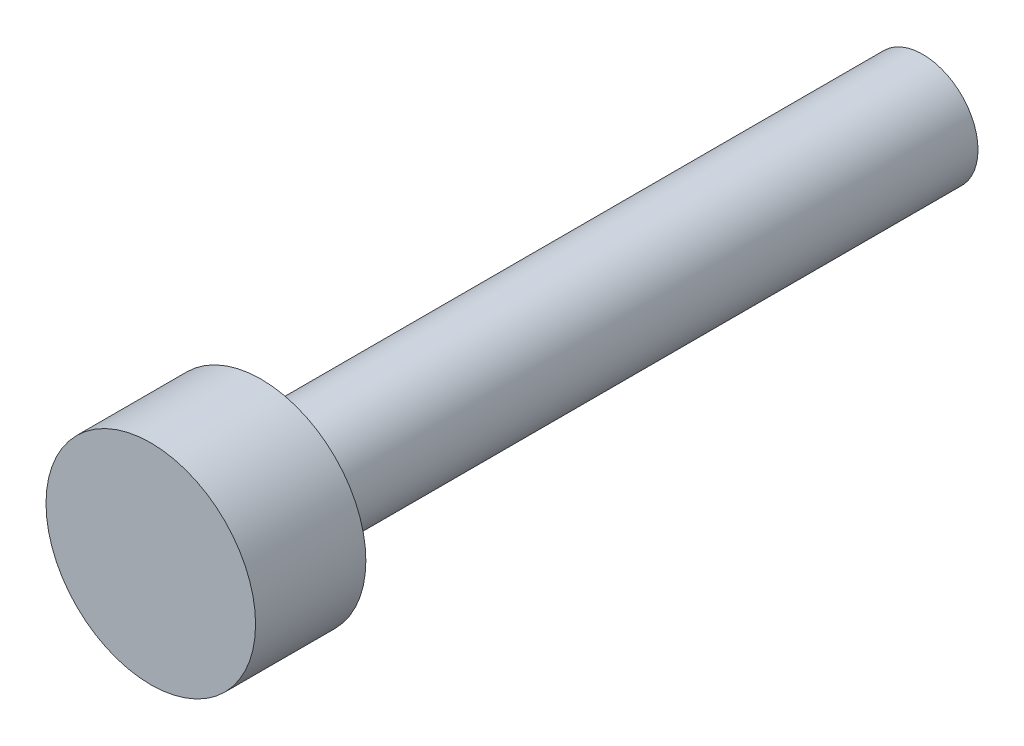
ISO-10303-21;
HEADER;
FILE_DESCRIPTION(('STEP AP214'),'2;1');
FILE_NAME('part.step','',(''),(''),'','','');
FILE_SCHEMA(('AUTOMOTIVE_DESIGN { 1 0 10303 214 1 1 1 1 }'));
ENDSEC;
DATA;
#1=APPLICATION_CONTEXT('core data for automotive mechanical design processes');
#2=APPLICATION_PROTOCOL_DEFINITION('international standard','automotive_design',2000,#1);
#3=PRODUCT_CONTEXT('',#1,'mechanical');
#4=PRODUCT('Part','Part','',(#3));
#5=PRODUCT_RELATED_PRODUCT_CATEGORY('part','',(#4));
#6=PRODUCT_DEFINITION_FORMATION('','',#4);
#7=PRODUCT_DEFINITION_CONTEXT('part definition',#1,'design');
#8=PRODUCT_DEFINITION('design','',#6,#7);
#9=PRODUCT_DEFINITION_SHAPE('','',#8);
#10=(LENGTH_UNIT() NAMED_UNIT(*) SI_UNIT(.MILLI.,.METRE.));
#11=(NAMED_UNIT(*) PLANE_ANGLE_UNIT() SI_UNIT($,.RADIAN.));
#12=(NAMED_UNIT(*) SI_UNIT($,.STERADIAN.) SOLID_ANGLE_UNIT());
#13=UNCERTAINTY_MEASURE_WITH_UNIT(LENGTH_MEASURE(1.E-05),#10,'distance_accuracy_value','');
#14=(GEOMETRIC_REPRESENTATION_CONTEXT(3) GLOBAL_UNCERTAINTY_ASSIGNED_CONTEXT((#13)) GLOBAL_UNIT_ASSIGNED_CONTEXT((#10,
#11,#12)) REPRESENTATION_CONTEXT('',''));
#15=CARTESIAN_POINT('',(0.,0.,0.));
#16=DIRECTION('',(0.,0.,1.));
#17=DIRECTION('',(1.,0.,0.));
#18=AXIS2_PLACEMENT_3D('',#15,#16,#17);
#19=CARTESIAN_POINT('',(0.,0.,0.));
#20=DIRECTION('',(0.,0.,-1.));
#21=DIRECTION('',(-1.,0.,0.));
#22=AXIS2_PLACEMENT_3D('',#19,#20,#21);
#23=CYLINDRICAL_SURFACE('',#22,1.);
#24=CARTESIAN_POINT('',(0.,0.,0.));
#25=DIRECTION('',(0.,0.,1.));
#26=DIRECTION('',(1.,0.,0.));
#27=AXIS2_PLACEMENT_3D('',#24,#25,#26);
#28=CIRCLE('',#27,1.);
#29=CARTESIAN_POINT('',(1.,0.,0.));
#30=VERTEX_POINT('',#29);
#31=EDGE_CURVE('E10',#30,#30,#28,.T.);
#32=ORIENTED_EDGE('',*,*,#31,.F.);
#33=EDGE_LOOP('',(#32));
#34=FACE_BOUND('',#33,.T.);
#35=CARTESIAN_POINT('',(0.,0.,-12.));
#36=DIRECTION('',(0.,0.,1.));
#37=DIRECTION('',(1.,0.,0.));
#38=AXIS2_PLACEMENT_3D('',#35,#36,#37);
#39=CIRCLE('',#38,1.);
#40=CARTESIAN_POINT('',(1.,0.,-12.));
#41=VERTEX_POINT('',#40);
#42=EDGE_CURVE('E37',#41,#41,#39,.T.);
#43=ORIENTED_EDGE('',*,*,#42,.T.);
#44=EDGE_LOOP('',(#43));
#45=FACE_BOUND('',#44,.T.);
#46=ADVANCED_FACE('F40',(#34,#45),#23,.T.);
#47=CARTESIAN_POINT('',(0.,0.,-12.));
#48=DIRECTION('',(0.,0.,1.));
#49=DIRECTION('',(1.,0.,0.));
#50=AXIS2_PLACEMENT_3D('',#47,#48,#49);
#51=PLANE('',#50);
#52=ORIENTED_EDGE('',*,*,#42,.F.);
#53=EDGE_LOOP('',(#52));
#54=FACE_BOUND('',#53,.T.);
#55=ADVANCED_FACE('F58',(#54),#51,.F.);
#56=CARTESIAN_POINT('',(0.,0.,2.));
#57=DIRECTION('',(0.,0.,-1.));
#58=DIRECTION('',(-1.,0.,0.));
#59=AXIS2_PLACEMENT_3D('',#56,#57,#58);
#60=CYLINDRICAL_SURFACE('',#59,1.9);
#61=CARTESIAN_POINT('',(0.,0.,2.));
#62=DIRECTION('',(0.,0.,1.));
#63=DIRECTION('',(1.,0.,0.));
#64=AXIS2_PLACEMENT_3D('',#61,#62,#63);
#65=CIRCLE('',#64,1.9);
#66=CARTESIAN_POINT('',(1.9,0.,2.));
#67=VERTEX_POINT('',#66);
#68=EDGE_CURVE('E50',#67,#67,#65,.T.);
#69=ORIENTED_EDGE('',*,*,#68,.F.);
#70=EDGE_LOOP('',(#69));
#71=FACE_BOUND('',#70,.T.);
#72=CARTESIAN_POINT('',(0.,0.,0.));
#73=DIRECTION('',(0.,0.,1.));
#74=DIRECTION('',(1.,0.,0.));
#75=AXIS2_PLACEMENT_3D('',#72,#73,#74);
#76=CIRCLE('',#75,1.9);
#77=CARTESIAN_POINT('',(1.9,0.,0.));
#78=VERTEX_POINT('',#77);
#79=EDGE_CURVE('E47',#78,#78,#76,.T.);
#80=ORIENTED_EDGE('',*,*,#79,.T.);
#81=EDGE_LOOP('',(#80));
#82=FACE_BOUND('',#81,.T.);
#83=ADVANCED_FACE('F60',(#71,#82),#60,.T.);
#84=CARTESIAN_POINT('',(0.,0.,2.));
#85=DIRECTION('',(0.,0.,1.));
#86=DIRECTION('',(1.,0.,0.));
#87=AXIS2_PLACEMENT_3D('',#84,#85,#86);
#88=PLANE('',#87);
#89=ORIENTED_EDGE('',*,*,#68,.T.);
#90=EDGE_LOOP('',(#89));
#91=FACE_BOUND('',#90,.T.);
#92=ADVANCED_FACE('F54',(#91),#88,.T.);
#93=CARTESIAN_POINT('',(0.,0.,0.));
#94=DIRECTION('',(0.,0.,1.));
#95=DIRECTION('',(1.,0.,0.));
#96=AXIS2_PLACEMENT_3D('',#93,#94,#95);
#97=PLANE('',#96);
#98=ORIENTED_EDGE('',*,*,#31,.T.);
#99=EDGE_LOOP('',(#98));
#100=FACE_BOUND('',#99,.T.);
#101=ORIENTED_EDGE('',*,*,#79,.F.);
#102=EDGE_LOOP('',(#101));
#103=FACE_BOUND('',#102,.T.);
#104=ADVANCED_FACE('F61',(#100,#103),#97,.F.);
#105=CLOSED_SHELL('',(#46,#55,#83,#92,#104));
#106=MANIFOLD_SOLID_BREP('B2',#105);
#107=ADVANCED_BREP_SHAPE_REPRESENTATION('',(#18,#106),#14);
#108=SHAPE_DEFINITION_REPRESENTATION(#9,#107);
ENDSEC;
END-ISO-10303-21;
